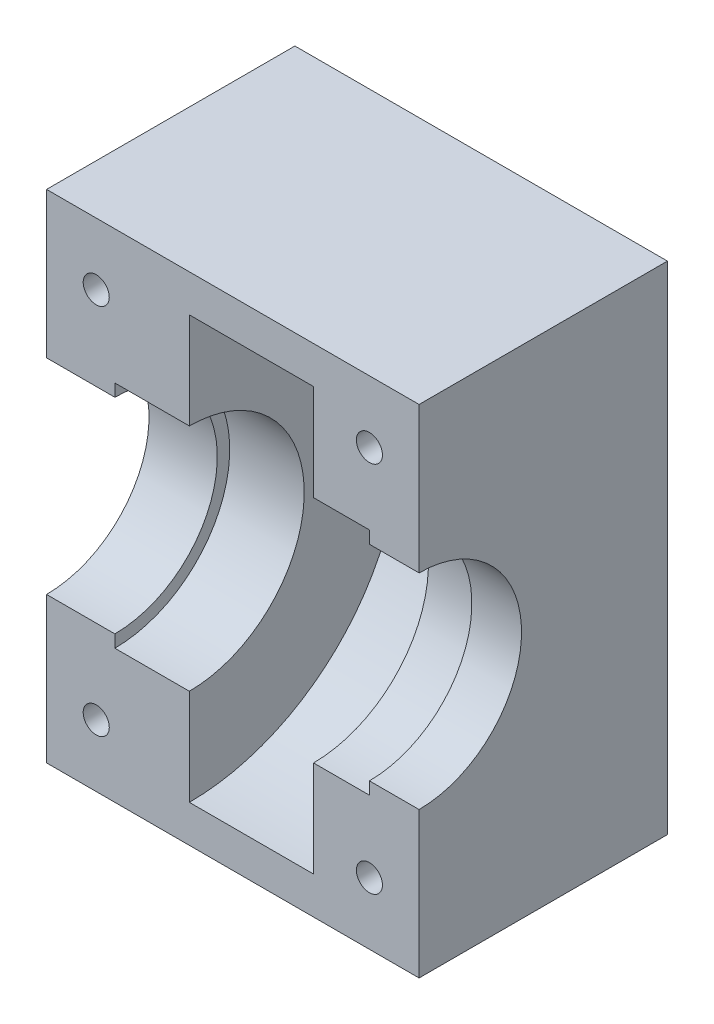
ISO-10303-21;
HEADER;
FILE_DESCRIPTION(('STEP AP214'),'2;1');
FILE_NAME('part.step','',(''),(''),'','','');
FILE_SCHEMA(('AUTOMOTIVE_DESIGN { 1 0 10303 214 1 1 1 1 }'));
ENDSEC;
DATA;
#1=APPLICATION_CONTEXT('core data for automotive mechanical design processes');
#2=APPLICATION_PROTOCOL_DEFINITION('international standard','automotive_design',2000,#1);
#3=PRODUCT_CONTEXT('',#1,'mechanical');
#4=PRODUCT('Part','Part','',(#3));
#5=PRODUCT_RELATED_PRODUCT_CATEGORY('part','',(#4));
#6=PRODUCT_DEFINITION_FORMATION('','',#4);
#7=PRODUCT_DEFINITION_CONTEXT('part definition',#1,'design');
#8=PRODUCT_DEFINITION('design','',#6,#7);
#9=PRODUCT_DEFINITION_SHAPE('','',#8);
#10=(LENGTH_UNIT() NAMED_UNIT(*) SI_UNIT(.MILLI.,.METRE.));
#11=(NAMED_UNIT(*) PLANE_ANGLE_UNIT() SI_UNIT($,.RADIAN.));
#12=(NAMED_UNIT(*) SI_UNIT($,.STERADIAN.) SOLID_ANGLE_UNIT());
#13=UNCERTAINTY_MEASURE_WITH_UNIT(LENGTH_MEASURE(1.E-05),#10,'distance_accuracy_value','');
#14=(GEOMETRIC_REPRESENTATION_CONTEXT(3) GLOBAL_UNCERTAINTY_ASSIGNED_CONTEXT((#13)) GLOBAL_UNIT_ASSIGNED_CONTEXT((#10,
#11,#12)) REPRESENTATION_CONTEXT('',''));
#15=CARTESIAN_POINT('',(0.,0.,0.));
#16=DIRECTION('',(0.,0.,1.));
#17=DIRECTION('',(1.,0.,0.));
#18=AXIS2_PLACEMENT_3D('',#15,#16,#17);
#19=CARTESIAN_POINT('',(0.,0.,40.));
#20=DIRECTION('',(0.,0.,1.));
#21=DIRECTION('',(1.,0.,0.));
#22=AXIS2_PLACEMENT_3D('',#19,#20,#21);
#23=PLANE('',#22);
#24=CARTESIAN_POINT('',(22.,30.,40.));
#25=DIRECTION('',(0.,0.,1.));
#26=DIRECTION('',(1.,0.,0.));
#27=AXIS2_PLACEMENT_3D('',#24,#25,#26);
#28=CIRCLE('',#27,2.1);
#29=CARTESIAN_POINT('',(24.1,30.,40.));
#30=VERTEX_POINT('',#29);
#31=EDGE_CURVE('E167',#30,#30,#28,.T.);
#32=ORIENTED_EDGE('',*,*,#31,.F.);
#33=EDGE_LOOP('',(#32));
#34=FACE_BOUND('',#33,.T.);
#35=CARTESIAN_POINT('',(-22.,30.,40.));
#36=DIRECTION('',(0.,0.,1.));
#37=DIRECTION('',(1.,0.,0.));
#38=AXIS2_PLACEMENT_3D('',#35,#36,#37);
#39=CIRCLE('',#38,2.1);
#40=CARTESIAN_POINT('',(-19.9,30.,40.));
#41=VERTEX_POINT('',#40);
#42=EDGE_CURVE('E183',#41,#41,#39,.T.);
#43=ORIENTED_EDGE('',*,*,#42,.F.);
#44=EDGE_LOOP('',(#43));
#45=FACE_BOUND('',#44,.T.);
#46=DIRECTION('',(-1.,0.,0.));
#47=VECTOR('',#46,1.);
#48=CARTESIAN_POINT('',(30.,16.5,40.));
#49=LINE('',#48,#47);
#50=CARTESIAN_POINT('',(30.,16.5,40.));
#51=VERTEX_POINT('',#50);
#52=CARTESIAN_POINT('',(22.,16.5,40.));
#53=VERTEX_POINT('',#52);
#54=EDGE_CURVE('E59',#51,#53,#49,.T.);
#55=ORIENTED_EDGE('',*,*,#54,.F.);
#56=DIRECTION('',(0.,1.,0.));
#57=VECTOR('',#56,1.);
#58=CARTESIAN_POINT('',(30.,-40.,40.));
#59=LINE('',#58,#57);
#60=CARTESIAN_POINT('',(30.,40.,40.));
#61=VERTEX_POINT('',#60);
#62=EDGE_CURVE('E234',#51,#61,#59,.T.);
#63=ORIENTED_EDGE('',*,*,#62,.T.);
#64=DIRECTION('',(-1.,0.,0.));
#65=VECTOR('',#64,1.);
#66=CARTESIAN_POINT('',(30.,40.,40.));
#67=LINE('',#66,#65);
#68=CARTESIAN_POINT('',(-30.,40.,40.));
#69=VERTEX_POINT('',#68);
#70=EDGE_CURVE('E238',#61,#69,#67,.T.);
#71=ORIENTED_EDGE('',*,*,#70,.T.);
#72=DIRECTION('',(0.,-1.,0.));
#73=VECTOR('',#72,1.);
#74=CARTESIAN_POINT('',(-30.,-40.,40.));
#75=LINE('',#74,#73);
#76=CARTESIAN_POINT('',(-30.,16.5,40.));
#77=VERTEX_POINT('',#76);
#78=EDGE_CURVE('E228',#69,#77,#75,.T.);
#79=ORIENTED_EDGE('',*,*,#78,.T.);
#80=DIRECTION('',(-1.,0.,0.));
#81=VECTOR('',#80,1.);
#82=CARTESIAN_POINT('',(-19.,16.5,40.));
#83=LINE('',#82,#81);
#84=CARTESIAN_POINT('',(-19.,16.5,40.));
#85=VERTEX_POINT('',#84);
#86=EDGE_CURVE('E263',#85,#77,#83,.T.);
#87=ORIENTED_EDGE('',*,*,#86,.F.);
#88=DIRECTION('',(0.,-1.,0.));
#89=VECTOR('',#88,1.);
#90=CARTESIAN_POINT('',(-19.,0.,40.));
#91=LINE('',#90,#89);
#92=CARTESIAN_POINT('',(-19.,18.5,40.));
#93=VERTEX_POINT('',#92);
#94=EDGE_CURVE('E222',#93,#85,#91,.T.);
#95=ORIENTED_EDGE('',*,*,#94,.F.);
#96=DIRECTION('',(-1.,0.,0.));
#97=VECTOR('',#96,1.);
#98=CARTESIAN_POINT('',(-6.99999999999999,18.5,40.));
#99=LINE('',#98,#97);
#100=CARTESIAN_POINT('',(-6.99999999999999,18.5,40.));
#101=VERTEX_POINT('',#100);
#102=EDGE_CURVE('E268',#101,#93,#99,.T.);
#103=ORIENTED_EDGE('',*,*,#102,.F.);
#104=DIRECTION('',(0.,-1.,0.));
#105=VECTOR('',#104,1.);
#106=CARTESIAN_POINT('',(-6.99999999999999,0.,40.));
#107=LINE('',#106,#105);
#108=CARTESIAN_POINT('',(-6.99999999999999,34.,40.));
#109=VERTEX_POINT('',#108);
#110=EDGE_CURVE('E214',#109,#101,#107,.T.);
#111=ORIENTED_EDGE('',*,*,#110,.F.);
#112=DIRECTION('',(-1.,0.,0.));
#113=VECTOR('',#112,1.);
#114=CARTESIAN_POINT('',(13.,34.,40.));
#115=LINE('',#114,#113);
#116=CARTESIAN_POINT('',(13.,34.,40.));
#117=VERTEX_POINT('',#116);
#118=EDGE_CURVE('E276',#117,#109,#115,.T.);
#119=ORIENTED_EDGE('',*,*,#118,.F.);
#120=DIRECTION('',(0.,-1.,0.));
#121=VECTOR('',#120,1.);
#122=CARTESIAN_POINT('',(13.,0.,40.));
#123=LINE('',#122,#121);
#124=CARTESIAN_POINT('',(13.,18.5,40.));
#125=VERTEX_POINT('',#124);
#126=EDGE_CURVE('E274',#117,#125,#123,.T.);
#127=ORIENTED_EDGE('',*,*,#126,.T.);
#128=DIRECTION('',(-1.,0.,0.));
#129=VECTOR('',#128,1.);
#130=CARTESIAN_POINT('',(22.,18.5,40.));
#131=LINE('',#130,#129);
#132=CARTESIAN_POINT('',(22.,18.5,40.));
#133=VERTEX_POINT('',#132);
#134=EDGE_CURVE('E67',#133,#125,#131,.T.);
#135=ORIENTED_EDGE('',*,*,#134,.F.);
#136=DIRECTION('',(0.,-1.,0.));
#137=VECTOR('',#136,1.);
#138=CARTESIAN_POINT('',(22.,0.,40.));
#139=LINE('',#138,#137);
#140=EDGE_CURVE('E11',#133,#53,#139,.T.);
#141=ORIENTED_EDGE('',*,*,#140,.T.);
#142=EDGE_LOOP('',(#55,#63,#71,#79,#87,#95,#103,#111,#119,#127,#135,#141));
#143=FACE_BOUND('',#142,.T.);
#144=ADVANCED_FACE('F44',(#34,#45,#143),#23,.T.);
#145=CARTESIAN_POINT('',(-30.,-40.,40.));
#146=DIRECTION('',(1.,0.,0.));
#147=DIRECTION('',(0.,0.,-1.));
#148=AXIS2_PLACEMENT_3D('',#145,#146,#147);
#149=PLANE('',#148);
#150=CARTESIAN_POINT('',(-30.,-16.5,40.));
#151=VERTEX_POINT('',#150);
#152=CARTESIAN_POINT('',(-30.,-40.,40.));
#153=VERTEX_POINT('',#152);
#154=EDGE_CURVE('E232',#151,#153,#75,.T.);
#155=ORIENTED_EDGE('',*,*,#154,.F.);
#156=CARTESIAN_POINT('',(-30.,0.,40.));
#157=DIRECTION('',(-1.,0.,0.));
#158=DIRECTION('',(0.,0.,1.));
#159=AXIS2_PLACEMENT_3D('',#156,#157,#158);
#160=CIRCLE('',#159,16.5);
#161=EDGE_CURVE('E226',#77,#151,#160,.T.);
#162=ORIENTED_EDGE('',*,*,#161,.F.);
#163=ORIENTED_EDGE('',*,*,#78,.F.);
#164=DIRECTION('',(0.,0.,-1.));
#165=VECTOR('',#164,1.);
#166=CARTESIAN_POINT('',(-30.,40.,40.));
#167=LINE('',#166,#165);
#168=CARTESIAN_POINT('',(-30.,40.,0.));
#169=VERTEX_POINT('',#168);
#170=EDGE_CURVE('E240',#69,#169,#167,.T.);
#171=ORIENTED_EDGE('',*,*,#170,.T.);
#172=DIRECTION('',(0.,-1.,0.));
#173=VECTOR('',#172,1.);
#174=CARTESIAN_POINT('',(-30.,-40.,0.));
#175=LINE('',#174,#173);
#176=CARTESIAN_POINT('',(-30.,-40.,0.));
#177=VERTEX_POINT('',#176);
#178=EDGE_CURVE('E225',#169,#177,#175,.T.);
#179=ORIENTED_EDGE('',*,*,#178,.T.);
#180=DIRECTION('',(0.,0.,-1.));
#181=VECTOR('',#180,1.);
#182=CARTESIAN_POINT('',(-30.,-40.,40.));
#183=LINE('',#182,#181);
#184=EDGE_CURVE('E257',#153,#177,#183,.T.);
#185=ORIENTED_EDGE('',*,*,#184,.F.);
#186=EDGE_LOOP('',(#155,#162,#163,#171,#179,#185));
#187=FACE_BOUND('',#186,.T.);
#188=ADVANCED_FACE('F46',(#187),#149,.F.);
#189=CARTESIAN_POINT('',(30.,-40.,40.));
#190=DIRECTION('',(0.,1.,0.));
#191=DIRECTION('',(-1.,0.,0.));
#192=AXIS2_PLACEMENT_3D('',#189,#190,#191);
#193=PLANE('',#192);
#194=DIRECTION('',(1.,0.,0.));
#195=VECTOR('',#194,1.);
#196=CARTESIAN_POINT('',(30.,-40.,0.));
#197=LINE('',#196,#195);
#198=CARTESIAN_POINT('',(30.,-40.,0.));
#199=VERTEX_POINT('',#198);
#200=EDGE_CURVE('E243',#177,#199,#197,.T.);
#201=ORIENTED_EDGE('',*,*,#200,.T.);
#202=DIRECTION('',(0.,0.,-1.));
#203=VECTOR('',#202,1.);
#204=CARTESIAN_POINT('',(30.,-40.,40.));
#205=LINE('',#204,#203);
#206=CARTESIAN_POINT('',(30.,-40.,40.));
#207=VERTEX_POINT('',#206);
#208=EDGE_CURVE('E254',#207,#199,#205,.T.);
#209=ORIENTED_EDGE('',*,*,#208,.F.);
#210=DIRECTION('',(1.,0.,0.));
#211=VECTOR('',#210,1.);
#212=CARTESIAN_POINT('',(30.,-40.,40.));
#213=LINE('',#212,#211);
#214=EDGE_CURVE('E231',#153,#207,#213,.T.);
#215=ORIENTED_EDGE('',*,*,#214,.F.);
#216=ORIENTED_EDGE('',*,*,#184,.T.);
#217=EDGE_LOOP('',(#201,#209,#215,#216));
#218=FACE_BOUND('',#217,.T.);
#219=ADVANCED_FACE('F322',(#218),#193,.F.);
#220=CARTESIAN_POINT('',(30.,-40.,40.));
#221=DIRECTION('',(-1.,0.,0.));
#222=DIRECTION('',(0.,-1.,0.));
#223=AXIS2_PLACEMENT_3D('',#220,#221,#222);
#224=PLANE('',#223);
#225=ORIENTED_EDGE('',*,*,#62,.F.);
#226=CARTESIAN_POINT('',(30.,0.,40.));
#227=DIRECTION('',(-1.,0.,0.));
#228=DIRECTION('',(0.,0.,1.));
#229=AXIS2_PLACEMENT_3D('',#226,#227,#228);
#230=CIRCLE('',#229,16.5);
#231=CARTESIAN_POINT('',(30.,-16.5,40.));
#232=VERTEX_POINT('',#231);
#233=EDGE_CURVE('E190',#51,#232,#230,.T.);
#234=ORIENTED_EDGE('',*,*,#233,.T.);
#235=EDGE_CURVE('E235',#207,#232,#59,.T.);
#236=ORIENTED_EDGE('',*,*,#235,.F.);
#237=ORIENTED_EDGE('',*,*,#208,.T.);
#238=DIRECTION('',(0.,1.,0.));
#239=VECTOR('',#238,1.);
#240=CARTESIAN_POINT('',(30.,-40.,0.));
#241=LINE('',#240,#239);
#242=CARTESIAN_POINT('',(30.,40.,0.));
#243=VERTEX_POINT('',#242);
#244=EDGE_CURVE('E245',#199,#243,#241,.T.);
#245=ORIENTED_EDGE('',*,*,#244,.T.);
#246=DIRECTION('',(0.,0.,-1.));
#247=VECTOR('',#246,1.);
#248=CARTESIAN_POINT('',(30.,40.,40.));
#249=LINE('',#248,#247);
#250=EDGE_CURVE('E251',#61,#243,#249,.T.);
#251=ORIENTED_EDGE('',*,*,#250,.F.);
#252=EDGE_LOOP('',(#225,#234,#236,#237,#245,#251));
#253=FACE_BOUND('',#252,.T.);
#254=ADVANCED_FACE('F326',(#253),#224,.F.);
#255=CARTESIAN_POINT('',(30.,40.,40.));
#256=DIRECTION('',(0.,-1.,0.));
#257=DIRECTION('',(1.,0.,0.));
#258=AXIS2_PLACEMENT_3D('',#255,#256,#257);
#259=PLANE('',#258);
#260=DIRECTION('',(-1.,0.,0.));
#261=VECTOR('',#260,1.);
#262=CARTESIAN_POINT('',(30.,40.,0.));
#263=LINE('',#262,#261);
#264=EDGE_CURVE('E247',#243,#169,#263,.T.);
#265=ORIENTED_EDGE('',*,*,#264,.T.);
#266=ORIENTED_EDGE('',*,*,#170,.F.);
#267=ORIENTED_EDGE('',*,*,#70,.F.);
#268=ORIENTED_EDGE('',*,*,#250,.T.);
#269=EDGE_LOOP('',(#265,#266,#267,#268));
#270=FACE_BOUND('',#269,.T.);
#271=ADVANCED_FACE('F352',(#270),#259,.F.);
#272=CARTESIAN_POINT('',(22.,-30.,40.));
#273=DIRECTION('',(0.,0.,1.));
#274=DIRECTION('',(1.,0.,0.));
#275=AXIS2_PLACEMENT_3D('',#272,#273,#274);
#276=CIRCLE('',#275,2.1);
#277=CARTESIAN_POINT('',(24.1,-30.,40.));
#278=VERTEX_POINT('',#277);
#279=EDGE_CURVE('E166',#278,#278,#276,.T.);
#280=ORIENTED_EDGE('',*,*,#279,.F.);
#281=EDGE_LOOP('',(#280));
#282=FACE_BOUND('',#281,.T.);
#283=CARTESIAN_POINT('',(-22.,-30.,40.));
#284=DIRECTION('',(0.,0.,1.));
#285=DIRECTION('',(1.,0.,0.));
#286=AXIS2_PLACEMENT_3D('',#283,#284,#285);
#287=CIRCLE('',#286,2.1);
#288=CARTESIAN_POINT('',(-19.9,-30.,40.));
#289=VERTEX_POINT('',#288);
#290=EDGE_CURVE('E177',#289,#289,#287,.T.);
#291=ORIENTED_EDGE('',*,*,#290,.F.);
#292=EDGE_LOOP('',(#291));
#293=FACE_BOUND('',#292,.T.);
#294=DIRECTION('',(-1.,0.,0.));
#295=VECTOR('',#294,1.);
#296=CARTESIAN_POINT('',(30.,-16.5,40.));
#297=LINE('',#296,#295);
#298=CARTESIAN_POINT('',(22.,-16.5,40.));
#299=VERTEX_POINT('',#298);
#300=EDGE_CURVE('E193',#299,#232,#297,.F.);
#301=ORIENTED_EDGE('',*,*,#300,.F.);
#302=CARTESIAN_POINT('',(22.,-18.5,40.));
#303=VERTEX_POINT('',#302);
#304=EDGE_CURVE('E52',#299,#303,#139,.T.);
#305=ORIENTED_EDGE('',*,*,#304,.T.);
#306=DIRECTION('',(-1.,0.,0.));
#307=VECTOR('',#306,1.);
#308=CARTESIAN_POINT('',(22.,-18.5,40.));
#309=LINE('',#308,#307);
#310=CARTESIAN_POINT('',(13.,-18.5,40.));
#311=VERTEX_POINT('',#310);
#312=EDGE_CURVE('E201',#311,#303,#309,.F.);
#313=ORIENTED_EDGE('',*,*,#312,.F.);
#314=CARTESIAN_POINT('',(13.,-34.,40.));
#315=VERTEX_POINT('',#314);
#316=EDGE_CURVE('E273',#311,#315,#123,.T.);
#317=ORIENTED_EDGE('',*,*,#316,.T.);
#318=DIRECTION('',(-1.,0.,0.));
#319=VECTOR('',#318,1.);
#320=CARTESIAN_POINT('',(13.,-34.,40.));
#321=LINE('',#320,#319);
#322=CARTESIAN_POINT('',(-6.99999999999999,-34.,40.));
#323=VERTEX_POINT('',#322);
#324=EDGE_CURVE('E270',#323,#315,#321,.F.);
#325=ORIENTED_EDGE('',*,*,#324,.F.);
#326=CARTESIAN_POINT('',(-6.99999999999999,-18.5,40.));
#327=VERTEX_POINT('',#326);
#328=EDGE_CURVE('E210',#327,#323,#107,.T.);
#329=ORIENTED_EDGE('',*,*,#328,.F.);
#330=DIRECTION('',(-1.,0.,0.));
#331=VECTOR('',#330,1.);
#332=CARTESIAN_POINT('',(-6.99999999999999,-18.5,40.));
#333=LINE('',#332,#331);
#334=CARTESIAN_POINT('',(-19.,-18.5,40.));
#335=VERTEX_POINT('',#334);
#336=EDGE_CURVE('E265',#335,#327,#333,.F.);
#337=ORIENTED_EDGE('',*,*,#336,.F.);
#338=CARTESIAN_POINT('',(-19.,-16.5,40.));
#339=VERTEX_POINT('',#338);
#340=EDGE_CURVE('E217',#339,#335,#91,.T.);
#341=ORIENTED_EDGE('',*,*,#340,.F.);
#342=DIRECTION('',(-1.,0.,0.));
#343=VECTOR('',#342,1.);
#344=CARTESIAN_POINT('',(-19.,-16.5,40.));
#345=LINE('',#344,#343);
#346=EDGE_CURVE('E260',#151,#339,#345,.F.);
#347=ORIENTED_EDGE('',*,*,#346,.F.);
#348=ORIENTED_EDGE('',*,*,#154,.T.);
#349=ORIENTED_EDGE('',*,*,#214,.T.);
#350=ORIENTED_EDGE('',*,*,#235,.T.);
#351=EDGE_LOOP('',(#301,#305,#313,#317,#325,#329,#337,#341,#347,#348,#349,#350));
#352=FACE_BOUND('',#351,.T.);
#353=ADVANCED_FACE('F285',(#282,#293,#352),#23,.T.);
#354=CARTESIAN_POINT('',(0.,0.,0.));
#355=DIRECTION('',(0.,0.,1.));
#356=DIRECTION('',(1.,0.,0.));
#357=AXIS2_PLACEMENT_3D('',#354,#355,#356);
#358=PLANE('',#357);
#359=ORIENTED_EDGE('',*,*,#178,.F.);
#360=ORIENTED_EDGE('',*,*,#264,.F.);
#361=ORIENTED_EDGE('',*,*,#244,.F.);
#362=ORIENTED_EDGE('',*,*,#200,.F.);
#363=EDGE_LOOP('',(#359,#360,#361,#362));
#364=FACE_BOUND('',#363,.T.);
#365=ADVANCED_FACE('F351',(#364),#358,.F.);
#366=CARTESIAN_POINT('',(-19.,0.,40.));
#367=DIRECTION('',(-1.,0.,0.));
#368=DIRECTION('',(0.,0.,1.));
#369=AXIS2_PLACEMENT_3D('',#366,#367,#368);
#370=CYLINDRICAL_SURFACE('',#369,16.5);
#371=ORIENTED_EDGE('',*,*,#86,.T.);
#372=ORIENTED_EDGE('',*,*,#161,.T.);
#373=ORIENTED_EDGE('',*,*,#346,.T.);
#374=CARTESIAN_POINT('',(-19.,0.,40.));
#375=DIRECTION('',(-1.,0.,0.));
#376=DIRECTION('',(0.,0.,1.));
#377=AXIS2_PLACEMENT_3D('',#374,#375,#376);
#378=CIRCLE('',#377,16.5);
#379=EDGE_CURVE('E223',#85,#339,#378,.T.);
#380=ORIENTED_EDGE('',*,*,#379,.F.);
#381=EDGE_LOOP('',(#371,#372,#373,#380));
#382=FACE_BOUND('',#381,.T.);
#383=ADVANCED_FACE('F314',(#382),#370,.F.);
#384=CARTESIAN_POINT('',(-19.,0.,40.));
#385=DIRECTION('',(-1.,0.,0.));
#386=DIRECTION('',(0.,0.,1.));
#387=AXIS2_PLACEMENT_3D('',#384,#385,#386);
#388=PLANE('',#387);
#389=ORIENTED_EDGE('',*,*,#94,.T.);
#390=ORIENTED_EDGE('',*,*,#379,.T.);
#391=ORIENTED_EDGE('',*,*,#340,.T.);
#392=CARTESIAN_POINT('',(-19.,0.,40.));
#393=DIRECTION('',(-1.,0.,0.));
#394=DIRECTION('',(0.,0.,1.));
#395=AXIS2_PLACEMENT_3D('',#392,#393,#394);
#396=CIRCLE('',#395,18.5);
#397=EDGE_CURVE('E218',#93,#335,#396,.T.);
#398=ORIENTED_EDGE('',*,*,#397,.F.);
#399=EDGE_LOOP('',(#389,#390,#391,#398));
#400=FACE_BOUND('',#399,.T.);
#401=ADVANCED_FACE('F308',(#400),#388,.F.);
#402=CARTESIAN_POINT('',(-6.99999999999999,0.,40.));
#403=DIRECTION('',(-1.,0.,0.));
#404=DIRECTION('',(0.,0.,1.));
#405=AXIS2_PLACEMENT_3D('',#402,#403,#404);
#406=CYLINDRICAL_SURFACE('',#405,18.5);
#407=ORIENTED_EDGE('',*,*,#102,.T.);
#408=ORIENTED_EDGE('',*,*,#397,.T.);
#409=ORIENTED_EDGE('',*,*,#336,.T.);
#410=CARTESIAN_POINT('',(-6.99999999999999,0.,40.));
#411=DIRECTION('',(-1.,0.,0.));
#412=DIRECTION('',(0.,0.,1.));
#413=AXIS2_PLACEMENT_3D('',#410,#411,#412);
#414=CIRCLE('',#413,18.5);
#415=EDGE_CURVE('E215',#101,#327,#414,.T.);
#416=ORIENTED_EDGE('',*,*,#415,.F.);
#417=EDGE_LOOP('',(#407,#408,#409,#416));
#418=FACE_BOUND('',#417,.T.);
#419=ADVANCED_FACE('F303',(#418),#406,.F.);
#420=CARTESIAN_POINT('',(-6.99999999999999,0.,40.));
#421=DIRECTION('',(-1.,0.,0.));
#422=DIRECTION('',(0.,0.,1.));
#423=AXIS2_PLACEMENT_3D('',#420,#421,#422);
#424=PLANE('',#423);
#425=ORIENTED_EDGE('',*,*,#110,.T.);
#426=ORIENTED_EDGE('',*,*,#415,.T.);
#427=ORIENTED_EDGE('',*,*,#328,.T.);
#428=CARTESIAN_POINT('',(-6.99999999999999,0.,40.));
#429=DIRECTION('',(-1.,0.,0.));
#430=DIRECTION('',(0.,0.,1.));
#431=AXIS2_PLACEMENT_3D('',#428,#429,#430);
#432=CIRCLE('',#431,34.);
#433=EDGE_CURVE('E206',#109,#323,#432,.T.);
#434=ORIENTED_EDGE('',*,*,#433,.F.);
#435=EDGE_LOOP('',(#425,#426,#427,#434));
#436=FACE_BOUND('',#435,.T.);
#437=ADVANCED_FACE('F512',(#436),#424,.F.);
#438=CARTESIAN_POINT('',(13.,0.,40.));
#439=DIRECTION('',(-1.,0.,0.));
#440=DIRECTION('',(0.,0.,1.));
#441=AXIS2_PLACEMENT_3D('',#438,#439,#440);
#442=CYLINDRICAL_SURFACE('',#441,34.);
#443=ORIENTED_EDGE('',*,*,#118,.T.);
#444=ORIENTED_EDGE('',*,*,#433,.T.);
#445=ORIENTED_EDGE('',*,*,#324,.T.);
#446=CARTESIAN_POINT('',(13.,0.,40.));
#447=DIRECTION('',(-1.,0.,0.));
#448=DIRECTION('',(0.,0.,1.));
#449=AXIS2_PLACEMENT_3D('',#446,#447,#448);
#450=CIRCLE('',#449,34.);
#451=EDGE_CURVE('E207',#117,#315,#450,.T.);
#452=ORIENTED_EDGE('',*,*,#451,.F.);
#453=EDGE_LOOP('',(#443,#444,#445,#452));
#454=FACE_BOUND('',#453,.T.);
#455=ADVANCED_FACE('F295',(#454),#442,.F.);
#456=CARTESIAN_POINT('',(13.,0.,40.));
#457=DIRECTION('',(-1.,0.,0.));
#458=DIRECTION('',(0.,0.,1.));
#459=AXIS2_PLACEMENT_3D('',#456,#457,#458);
#460=PLANE('',#459);
#461=CARTESIAN_POINT('',(13.,0.,40.));
#462=DIRECTION('',(-1.,0.,0.));
#463=DIRECTION('',(0.,0.,1.));
#464=AXIS2_PLACEMENT_3D('',#461,#462,#463);
#465=CIRCLE('',#464,18.5);
#466=EDGE_CURVE('E197',#125,#311,#465,.T.);
#467=ORIENTED_EDGE('',*,*,#466,.F.);
#468=ORIENTED_EDGE('',*,*,#126,.F.);
#469=ORIENTED_EDGE('',*,*,#451,.T.);
#470=ORIENTED_EDGE('',*,*,#316,.F.);
#471=EDGE_LOOP('',(#467,#468,#469,#470));
#472=FACE_BOUND('',#471,.T.);
#473=ADVANCED_FACE('F294',(#472),#460,.T.);
#474=CARTESIAN_POINT('',(22.,0.,40.));
#475=DIRECTION('',(-1.,0.,0.));
#476=DIRECTION('',(0.,0.,1.));
#477=AXIS2_PLACEMENT_3D('',#474,#475,#476);
#478=CYLINDRICAL_SURFACE('',#477,18.5);
#479=ORIENTED_EDGE('',*,*,#134,.T.);
#480=ORIENTED_EDGE('',*,*,#466,.T.);
#481=ORIENTED_EDGE('',*,*,#312,.T.);
#482=CARTESIAN_POINT('',(22.,0.,40.));
#483=DIRECTION('',(-1.,0.,0.));
#484=DIRECTION('',(0.,0.,1.));
#485=AXIS2_PLACEMENT_3D('',#482,#483,#484);
#486=CIRCLE('',#485,18.5);
#487=EDGE_CURVE('E198',#133,#303,#486,.T.);
#488=ORIENTED_EDGE('',*,*,#487,.F.);
#489=EDGE_LOOP('',(#479,#480,#481,#488));
#490=FACE_BOUND('',#489,.T.);
#491=ADVANCED_FACE('F288',(#490),#478,.F.);
#492=CARTESIAN_POINT('',(22.,0.,40.));
#493=DIRECTION('',(-1.,0.,0.));
#494=DIRECTION('',(0.,0.,1.));
#495=AXIS2_PLACEMENT_3D('',#492,#493,#494);
#496=PLANE('',#495);
#497=CARTESIAN_POINT('',(22.,0.,40.));
#498=DIRECTION('',(-1.,0.,0.));
#499=DIRECTION('',(0.,0.,1.));
#500=AXIS2_PLACEMENT_3D('',#497,#498,#499);
#501=CIRCLE('',#500,16.5);
#502=EDGE_CURVE('E189',#53,#299,#501,.T.);
#503=ORIENTED_EDGE('',*,*,#502,.F.);
#504=ORIENTED_EDGE('',*,*,#140,.F.);
#505=ORIENTED_EDGE('',*,*,#487,.T.);
#506=ORIENTED_EDGE('',*,*,#304,.F.);
#507=EDGE_LOOP('',(#503,#504,#505,#506));
#508=FACE_BOUND('',#507,.T.);
#509=ADVANCED_FACE('F289',(#508),#496,.T.);
#510=CARTESIAN_POINT('',(30.,0.,40.));
#511=DIRECTION('',(-1.,0.,0.));
#512=DIRECTION('',(0.,0.,1.));
#513=AXIS2_PLACEMENT_3D('',#510,#511,#512);
#514=CYLINDRICAL_SURFACE('',#513,16.5);
#515=ORIENTED_EDGE('',*,*,#54,.T.);
#516=ORIENTED_EDGE('',*,*,#502,.T.);
#517=ORIENTED_EDGE('',*,*,#300,.T.);
#518=ORIENTED_EDGE('',*,*,#233,.F.);
#519=EDGE_LOOP('',(#515,#516,#517,#518));
#520=FACE_BOUND('',#519,.T.);
#521=ADVANCED_FACE('F328',(#520),#514,.F.);
#522=CARTESIAN_POINT('',(-22.,30.,26.));
#523=DIRECTION('',(0.,0.,1.));
#524=DIRECTION('',(1.,0.,0.));
#525=AXIS2_PLACEMENT_3D('',#522,#523,#524);
#526=CONICAL_SURFACE('',#525,2.1,1.02974425867665);
#527=CARTESIAN_POINT('',(-22.,30.,24.7381927000421));
#528=VERTEX_POINT('',#527);
#529=VERTEX_LOOP('',#528);
#530=FACE_BOUND('',#529,.T.);
#531=CARTESIAN_POINT('',(-22.,30.,26.));
#532=DIRECTION('',(0.,0.,1.));
#533=DIRECTION('',(1.,0.,0.));
#534=AXIS2_PLACEMENT_3D('',#531,#532,#533);
#535=CIRCLE('',#534,2.1);
#536=CARTESIAN_POINT('',(-19.9,30.,26.));
#537=VERTEX_POINT('',#536);
#538=EDGE_CURVE('E186',#537,#537,#535,.T.);
#539=ORIENTED_EDGE('',*,*,#538,.T.);
#540=EDGE_LOOP('',(#539));
#541=FACE_BOUND('',#540,.T.);
#542=ADVANCED_FACE('F330',(#530,#541),#526,.F.);
#543=CARTESIAN_POINT('',(-22.,30.,40.));
#544=DIRECTION('',(0.,0.,1.));
#545=DIRECTION('',(1.,0.,0.));
#546=AXIS2_PLACEMENT_3D('',#543,#544,#545);
#547=CYLINDRICAL_SURFACE('',#546,2.1);
#548=ORIENTED_EDGE('',*,*,#538,.F.);
#549=EDGE_LOOP('',(#548));
#550=FACE_BOUND('',#549,.T.);
#551=ORIENTED_EDGE('',*,*,#42,.T.);
#552=EDGE_LOOP('',(#551));
#553=FACE_BOUND('',#552,.T.);
#554=ADVANCED_FACE('F336',(#550,#553),#547,.F.);
#555=CARTESIAN_POINT('',(-22.,-30.,26.));
#556=DIRECTION('',(0.,0.,1.));
#557=DIRECTION('',(1.,0.,0.));
#558=AXIS2_PLACEMENT_3D('',#555,#556,#557);
#559=CONICAL_SURFACE('',#558,2.1,1.02974425867665);
#560=CARTESIAN_POINT('',(-22.,-30.,24.7381927000421));
#561=VERTEX_POINT('',#560);
#562=VERTEX_LOOP('',#561);
#563=FACE_BOUND('',#562,.T.);
#564=CARTESIAN_POINT('',(-22.,-30.,26.));
#565=DIRECTION('',(0.,0.,1.));
#566=DIRECTION('',(1.,0.,0.));
#567=AXIS2_PLACEMENT_3D('',#564,#565,#566);
#568=CIRCLE('',#567,2.1);
#569=CARTESIAN_POINT('',(-19.9,-30.,26.));
#570=VERTEX_POINT('',#569);
#571=EDGE_CURVE('E180',#570,#570,#568,.T.);
#572=ORIENTED_EDGE('',*,*,#571,.T.);
#573=EDGE_LOOP('',(#572));
#574=FACE_BOUND('',#573,.T.);
#575=ADVANCED_FACE('F368',(#563,#574),#559,.F.);
#576=CARTESIAN_POINT('',(-22.,-30.,40.));
#577=DIRECTION('',(0.,0.,1.));
#578=DIRECTION('',(1.,0.,0.));
#579=AXIS2_PLACEMENT_3D('',#576,#577,#578);
#580=CYLINDRICAL_SURFACE('',#579,2.1);
#581=ORIENTED_EDGE('',*,*,#571,.F.);
#582=EDGE_LOOP('',(#581));
#583=FACE_BOUND('',#582,.T.);
#584=ORIENTED_EDGE('',*,*,#290,.T.);
#585=EDGE_LOOP('',(#584));
#586=FACE_BOUND('',#585,.T.);
#587=ADVANCED_FACE('F365',(#583,#586),#580,.F.);
#588=CARTESIAN_POINT('',(22.,-30.,26.));
#589=DIRECTION('',(0.,0.,1.));
#590=DIRECTION('',(1.,0.,0.));
#591=AXIS2_PLACEMENT_3D('',#588,#589,#590);
#592=CONICAL_SURFACE('',#591,2.1,1.02974425867665);
#593=CARTESIAN_POINT('',(22.,-30.,24.7381927000421));
#594=VERTEX_POINT('',#593);
#595=VERTEX_LOOP('',#594);
#596=FACE_BOUND('',#595,.T.);
#597=CARTESIAN_POINT('',(22.,-30.,26.));
#598=DIRECTION('',(0.,0.,1.));
#599=DIRECTION('',(1.,0.,0.));
#600=AXIS2_PLACEMENT_3D('',#597,#598,#599);
#601=CIRCLE('',#600,2.1);
#602=CARTESIAN_POINT('',(24.1,-30.,26.));
#603=VERTEX_POINT('',#602);
#604=EDGE_CURVE('E170',#603,#603,#601,.T.);
#605=ORIENTED_EDGE('',*,*,#604,.T.);
#606=EDGE_LOOP('',(#605));
#607=FACE_BOUND('',#606,.T.);
#608=ADVANCED_FACE('F367',(#596,#607),#592,.F.);
#609=CARTESIAN_POINT('',(22.,-30.,40.));
#610=DIRECTION('',(0.,0.,1.));
#611=DIRECTION('',(1.,0.,0.));
#612=AXIS2_PLACEMENT_3D('',#609,#610,#611);
#613=CYLINDRICAL_SURFACE('',#612,2.1);
#614=ORIENTED_EDGE('',*,*,#604,.F.);
#615=EDGE_LOOP('',(#614));
#616=FACE_BOUND('',#615,.T.);
#617=ORIENTED_EDGE('',*,*,#279,.T.);
#618=EDGE_LOOP('',(#617));
#619=FACE_BOUND('',#618,.T.);
#620=ADVANCED_FACE('F160',(#616,#619),#613,.F.);
#621=CARTESIAN_POINT('',(22.,30.,26.));
#622=DIRECTION('',(0.,0.,1.));
#623=DIRECTION('',(1.,0.,0.));
#624=AXIS2_PLACEMENT_3D('',#621,#622,#623);
#625=CONICAL_SURFACE('',#624,2.1,1.02974425867665);
#626=CARTESIAN_POINT('',(22.,30.,24.7381927000421));
#627=VERTEX_POINT('',#626);
#628=VERTEX_LOOP('',#627);
#629=FACE_BOUND('',#628,.T.);
#630=CARTESIAN_POINT('',(22.,30.,26.));
#631=DIRECTION('',(0.,0.,1.));
#632=DIRECTION('',(1.,0.,0.));
#633=AXIS2_PLACEMENT_3D('',#630,#631,#632);
#634=CIRCLE('',#633,2.1);
#635=CARTESIAN_POINT('',(24.1,30.,26.));
#636=VERTEX_POINT('',#635);
#637=EDGE_CURVE('E164',#636,#636,#634,.T.);
#638=ORIENTED_EDGE('',*,*,#637,.T.);
#639=EDGE_LOOP('',(#638));
#640=FACE_BOUND('',#639,.T.);
#641=ADVANCED_FACE('F156',(#629,#640),#625,.F.);
#642=CARTESIAN_POINT('',(22.,30.,40.));
#643=DIRECTION('',(0.,0.,1.));
#644=DIRECTION('',(1.,0.,0.));
#645=AXIS2_PLACEMENT_3D('',#642,#643,#644);
#646=CYLINDRICAL_SURFACE('',#645,2.1);
#647=ORIENTED_EDGE('',*,*,#637,.F.);
#648=EDGE_LOOP('',(#647));
#649=FACE_BOUND('',#648,.T.);
#650=ORIENTED_EDGE('',*,*,#31,.T.);
#651=EDGE_LOOP('',(#650));
#652=FACE_BOUND('',#651,.T.);
#653=ADVANCED_FACE('F159',(#649,#652),#646,.F.);
#654=CLOSED_SHELL('',(#144,#188,#219,#254,#271,#353,#365,#383,#401,#419,#437,#455,#473,#491,
#509,#521,#542,#554,#575,#587,#608,#620,#641,#653));
#655=MANIFOLD_SOLID_BREP('B2',#654);
#656=ADVANCED_BREP_SHAPE_REPRESENTATION('',(#18,#655),#14);
#657=SHAPE_DEFINITION_REPRESENTATION(#9,#656);
ENDSEC;
END-ISO-10303-21;
